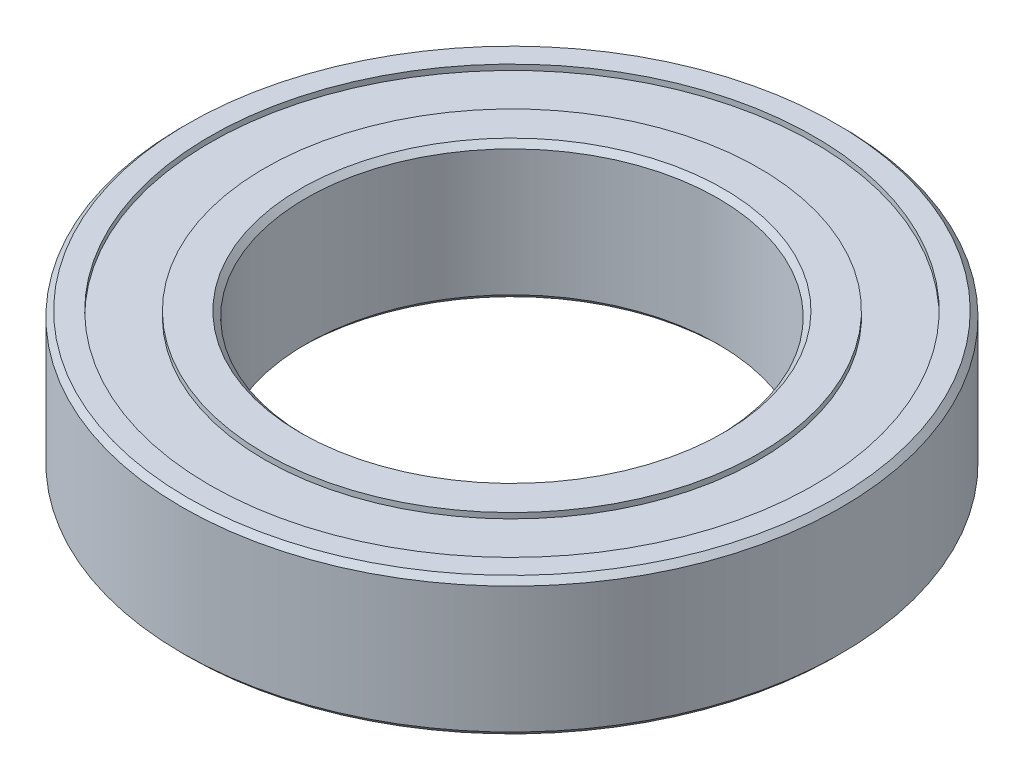
ISO-10303-21;
HEADER;
FILE_DESCRIPTION(('STEP AP214'),'2;1');
FILE_NAME('part.step','',(''),(''),'','','');
FILE_SCHEMA(('AUTOMOTIVE_DESIGN { 1 0 10303 214 1 1 1 1 }'));
ENDSEC;
DATA;
#1=APPLICATION_CONTEXT('core data for automotive mechanical design processes');
#2=APPLICATION_PROTOCOL_DEFINITION('international standard','automotive_design',2000,#1);
#3=PRODUCT_CONTEXT('',#1,'mechanical');
#4=PRODUCT('Part','Part','',(#3));
#5=PRODUCT_RELATED_PRODUCT_CATEGORY('part','',(#4));
#6=PRODUCT_DEFINITION_FORMATION('','',#4);
#7=PRODUCT_DEFINITION_CONTEXT('part definition',#1,'design');
#8=PRODUCT_DEFINITION('design','',#6,#7);
#9=PRODUCT_DEFINITION_SHAPE('','',#8);
#10=(LENGTH_UNIT() NAMED_UNIT(*) SI_UNIT(.MILLI.,.METRE.));
#11=(NAMED_UNIT(*) PLANE_ANGLE_UNIT() SI_UNIT($,.RADIAN.));
#12=(NAMED_UNIT(*) SI_UNIT($,.STERADIAN.) SOLID_ANGLE_UNIT());
#13=UNCERTAINTY_MEASURE_WITH_UNIT(LENGTH_MEASURE(1.E-05),#10,'distance_accuracy_value','');
#14=(GEOMETRIC_REPRESENTATION_CONTEXT(3) GLOBAL_UNCERTAINTY_ASSIGNED_CONTEXT((#13)) GLOBAL_UNIT_ASSIGNED_CONTEXT((#10,
#11,#12)) REPRESENTATION_CONTEXT('',''));
#15=CARTESIAN_POINT('',(0.,0.,0.));
#16=DIRECTION('',(0.,0.,1.));
#17=DIRECTION('',(1.,0.,0.));
#18=AXIS2_PLACEMENT_3D('',#15,#16,#17);
#19=CARTESIAN_POINT('',(0.,0.,0.));
#20=DIRECTION('',(0.,1.,0.));
#21=DIRECTION('',(0.,0.,1.));
#22=AXIS2_PLACEMENT_3D('',#19,#20,#21);
#23=PLANE('',#22);
#24=CARTESIAN_POINT('',(0.,0.,0.));
#25=DIRECTION('',(0.,1.,0.));
#26=DIRECTION('',(0.,0.,1.));
#27=AXIS2_PLACEMENT_3D('',#24,#25,#26);
#28=CIRCLE('',#27,7.7);
#29=CARTESIAN_POINT('',(0.,0.,7.7));
#30=VERTEX_POINT('',#29);
#31=EDGE_CURVE('E10',#30,#30,#28,.T.);
#32=ORIENTED_EDGE('',*,*,#31,.T.);
#33=EDGE_LOOP('',(#32));
#34=FACE_BOUND('',#33,.T.);
#35=CARTESIAN_POINT('',(0.,0.,0.));
#36=DIRECTION('',(0.,-1.,0.));
#37=DIRECTION('',(0.,0.,-1.));
#38=AXIS2_PLACEMENT_3D('',#35,#36,#37);
#39=CIRCLE('',#38,9.);
#40=CARTESIAN_POINT('',(0.,0.,-9.));
#41=VERTEX_POINT('',#40);
#42=EDGE_CURVE('E86',#41,#41,#39,.T.);
#43=ORIENTED_EDGE('',*,*,#42,.T.);
#44=EDGE_LOOP('',(#43));
#45=FACE_BOUND('',#44,.T.);
#46=ADVANCED_FACE('F34',(#34,#45),#23,.F.);
#47=CARTESIAN_POINT('',(0.,5.,0.));
#48=DIRECTION('',(0.,1.,0.));
#49=DIRECTION('',(0.,0.,1.));
#50=AXIS2_PLACEMENT_3D('',#47,#48,#49);
#51=PLANE('',#50);
#52=CARTESIAN_POINT('',(0.,5.,0.));
#53=DIRECTION('',(0.,1.,0.));
#54=DIRECTION('',(0.,0.,1.));
#55=AXIS2_PLACEMENT_3D('',#52,#53,#54);
#56=CIRCLE('',#55,7.7);
#57=CARTESIAN_POINT('',(0.,5.,7.7));
#58=VERTEX_POINT('',#57);
#59=EDGE_CURVE('E42',#58,#58,#56,.F.);
#60=ORIENTED_EDGE('',*,*,#59,.T.);
#61=EDGE_LOOP('',(#60));
#62=FACE_BOUND('',#61,.T.);
#63=CARTESIAN_POINT('',(0.,5.,0.));
#64=DIRECTION('',(0.,1.,0.));
#65=DIRECTION('',(0.,0.,1.));
#66=AXIS2_PLACEMENT_3D('',#63,#64,#65);
#67=CIRCLE('',#66,9.);
#68=CARTESIAN_POINT('',(0.,5.,9.));
#69=VERTEX_POINT('',#68);
#70=EDGE_CURVE('E74',#69,#69,#67,.T.);
#71=ORIENTED_EDGE('',*,*,#70,.T.);
#72=EDGE_LOOP('',(#71));
#73=FACE_BOUND('',#72,.T.);
#74=ADVANCED_FACE('F121',(#62,#73),#51,.T.);
#75=CARTESIAN_POINT('',(0.,5.,0.));
#76=DIRECTION('',(0.,1.,0.));
#77=DIRECTION('',(0.,0.,1.));
#78=AXIS2_PLACEMENT_3D('',#75,#76,#77);
#79=CIRCLE('',#78,11.8);
#80=CARTESIAN_POINT('',(0.,5.,11.8));
#81=VERTEX_POINT('',#80);
#82=EDGE_CURVE('E64',#81,#81,#79,.T.);
#83=ORIENTED_EDGE('',*,*,#82,.T.);
#84=EDGE_LOOP('',(#83));
#85=FACE_BOUND('',#84,.T.);
#86=CARTESIAN_POINT('',(0.,5.,0.));
#87=DIRECTION('',(0.,1.,0.));
#88=DIRECTION('',(0.,0.,1.));
#89=AXIS2_PLACEMENT_3D('',#86,#87,#88);
#90=CIRCLE('',#89,11.);
#91=CARTESIAN_POINT('',(0.,5.,11.));
#92=VERTEX_POINT('',#91);
#93=EDGE_CURVE('E68',#92,#92,#90,.T.);
#94=ORIENTED_EDGE('',*,*,#93,.F.);
#95=EDGE_LOOP('',(#94));
#96=FACE_BOUND('',#95,.T.);
#97=ADVANCED_FACE('F111',(#85,#96),#51,.T.);
#98=CARTESIAN_POINT('',(0.,0.,0.));
#99=DIRECTION('',(0.,1.,0.));
#100=DIRECTION('',(0.,0.,1.));
#101=AXIS2_PLACEMENT_3D('',#98,#99,#100);
#102=CIRCLE('',#101,11.8);
#103=CARTESIAN_POINT('',(0.,0.,11.8));
#104=VERTEX_POINT('',#103);
#105=EDGE_CURVE('E55',#104,#104,#102,.F.);
#106=ORIENTED_EDGE('',*,*,#105,.T.);
#107=EDGE_LOOP('',(#106));
#108=FACE_BOUND('',#107,.T.);
#109=CARTESIAN_POINT('',(0.,0.,0.));
#110=DIRECTION('',(0.,-1.,0.));
#111=DIRECTION('',(0.,0.,-1.));
#112=AXIS2_PLACEMENT_3D('',#109,#110,#111);
#113=CIRCLE('',#112,11.);
#114=CARTESIAN_POINT('',(0.,0.,-11.));
#115=VERTEX_POINT('',#114);
#116=EDGE_CURVE('E80',#115,#115,#113,.T.);
#117=ORIENTED_EDGE('',*,*,#116,.F.);
#118=EDGE_LOOP('',(#117));
#119=FACE_BOUND('',#118,.T.);
#120=ADVANCED_FACE('F108',(#108,#119),#23,.F.);
#121=CARTESIAN_POINT('',(0.,5.,0.));
#122=DIRECTION('',(0.,-1.,0.));
#123=DIRECTION('',(0.,0.,-1.));
#124=AXIS2_PLACEMENT_3D('',#121,#122,#123);
#125=CYLINDRICAL_SURFACE('',#124,12.);
#126=CARTESIAN_POINT('',(0.,4.8,0.));
#127=DIRECTION('',(0.,1.,0.));
#128=DIRECTION('',(0.,0.,1.));
#129=AXIS2_PLACEMENT_3D('',#126,#127,#128);
#130=CIRCLE('',#129,12.);
#131=CARTESIAN_POINT('',(0.,4.8,12.));
#132=VERTEX_POINT('',#131);
#133=EDGE_CURVE('E58',#132,#132,#130,.F.);
#134=ORIENTED_EDGE('',*,*,#133,.T.);
#135=EDGE_LOOP('',(#134));
#136=FACE_BOUND('',#135,.T.);
#137=CARTESIAN_POINT('',(0.,0.200000000000002,0.));
#138=DIRECTION('',(0.,1.,0.));
#139=DIRECTION('',(0.,0.,1.));
#140=AXIS2_PLACEMENT_3D('',#137,#138,#139);
#141=CIRCLE('',#140,12.);
#142=CARTESIAN_POINT('',(0.,0.200000000000002,12.));
#143=VERTEX_POINT('',#142);
#144=EDGE_CURVE('E61',#143,#143,#141,.T.);
#145=ORIENTED_EDGE('',*,*,#144,.T.);
#146=EDGE_LOOP('',(#145));
#147=FACE_BOUND('',#146,.T.);
#148=ADVANCED_FACE('F110',(#136,#147),#125,.T.);
#149=CARTESIAN_POINT('',(0.,5.,0.));
#150=DIRECTION('',(0.,-1.,0.));
#151=DIRECTION('',(0.,0.,-1.));
#152=AXIS2_PLACEMENT_3D('',#149,#150,#151);
#153=CYLINDRICAL_SURFACE('',#152,7.5);
#154=CARTESIAN_POINT('',(0.,4.8,0.));
#155=DIRECTION('',(0.,1.,0.));
#156=DIRECTION('',(0.,0.,1.));
#157=AXIS2_PLACEMENT_3D('',#154,#155,#156);
#158=CIRCLE('',#157,7.5);
#159=CARTESIAN_POINT('',(0.,4.8,7.5));
#160=VERTEX_POINT('',#159);
#161=EDGE_CURVE('E46',#160,#160,#158,.T.);
#162=ORIENTED_EDGE('',*,*,#161,.T.);
#163=EDGE_LOOP('',(#162));
#164=FACE_BOUND('',#163,.T.);
#165=CARTESIAN_POINT('',(0.,0.200000000000001,0.));
#166=DIRECTION('',(0.,1.,0.));
#167=DIRECTION('',(0.,0.,1.));
#168=AXIS2_PLACEMENT_3D('',#165,#166,#167);
#169=CIRCLE('',#168,7.5);
#170=CARTESIAN_POINT('',(0.,0.200000000000001,7.5));
#171=VERTEX_POINT('',#170);
#172=EDGE_CURVE('E50',#171,#171,#169,.F.);
#173=ORIENTED_EDGE('',*,*,#172,.T.);
#174=EDGE_LOOP('',(#173));
#175=FACE_BOUND('',#174,.T.);
#176=ADVANCED_FACE('F118',(#164,#175),#153,.F.);
#177=CARTESIAN_POINT('',(0.,4.8,0.));
#178=DIRECTION('',(0.,1.,0.));
#179=DIRECTION('',(0.,0.,1.));
#180=AXIS2_PLACEMENT_3D('',#177,#178,#179);
#181=CYLINDRICAL_SURFACE('',#180,11.);
#182=CARTESIAN_POINT('',(0.,4.8,0.));
#183=DIRECTION('',(0.,1.,0.));
#184=DIRECTION('',(0.,0.,1.));
#185=AXIS2_PLACEMENT_3D('',#182,#183,#184);
#186=CIRCLE('',#185,11.);
#187=CARTESIAN_POINT('',(0.,4.8,11.));
#188=VERTEX_POINT('',#187);
#189=EDGE_CURVE('E67',#188,#188,#186,.T.);
#190=ORIENTED_EDGE('',*,*,#189,.F.);
#191=EDGE_LOOP('',(#190));
#192=FACE_BOUND('',#191,.T.);
#193=ORIENTED_EDGE('',*,*,#93,.T.);
#194=EDGE_LOOP('',(#193));
#195=FACE_BOUND('',#194,.T.);
#196=ADVANCED_FACE('F146',(#192,#195),#181,.F.);
#197=CARTESIAN_POINT('',(0.,4.8,0.));
#198=DIRECTION('',(0.,1.,0.));
#199=DIRECTION('',(0.,0.,1.));
#200=AXIS2_PLACEMENT_3D('',#197,#198,#199);
#201=PLANE('',#200);
#202=CARTESIAN_POINT('',(0.,4.8,0.));
#203=DIRECTION('',(0.,1.,0.));
#204=DIRECTION('',(0.,0.,1.));
#205=AXIS2_PLACEMENT_3D('',#202,#203,#204);
#206=CIRCLE('',#205,9.);
#207=CARTESIAN_POINT('',(0.,4.8,9.));
#208=VERTEX_POINT('',#207);
#209=EDGE_CURVE('E71',#208,#208,#206,.T.);
#210=ORIENTED_EDGE('',*,*,#209,.F.);
#211=EDGE_LOOP('',(#210));
#212=FACE_BOUND('',#211,.T.);
#213=ORIENTED_EDGE('',*,*,#189,.T.);
#214=EDGE_LOOP('',(#213));
#215=FACE_BOUND('',#214,.T.);
#216=ADVANCED_FACE('F142',(#212,#215),#201,.T.);
#217=CARTESIAN_POINT('',(0.,4.8,0.));
#218=DIRECTION('',(0.,1.,0.));
#219=DIRECTION('',(0.,0.,1.));
#220=AXIS2_PLACEMENT_3D('',#217,#218,#219);
#221=CYLINDRICAL_SURFACE('',#220,9.);
#222=ORIENTED_EDGE('',*,*,#209,.T.);
#223=EDGE_LOOP('',(#222));
#224=FACE_BOUND('',#223,.T.);
#225=ORIENTED_EDGE('',*,*,#70,.F.);
#226=EDGE_LOOP('',(#225));
#227=FACE_BOUND('',#226,.T.);
#228=ADVANCED_FACE('F104',(#224,#227),#221,.T.);
#229=CARTESIAN_POINT('',(0.,0.2,0.));
#230=DIRECTION('',(0.,-1.,0.));
#231=DIRECTION('',(0.,0.,-1.));
#232=AXIS2_PLACEMENT_3D('',#229,#230,#231);
#233=CYLINDRICAL_SURFACE('',#232,11.);
#234=CARTESIAN_POINT('',(0.,0.2,0.));
#235=DIRECTION('',(0.,-1.,0.));
#236=DIRECTION('',(0.,0.,-1.));
#237=AXIS2_PLACEMENT_3D('',#234,#235,#236);
#238=CIRCLE('',#237,11.);
#239=CARTESIAN_POINT('',(0.,0.2,-11.));
#240=VERTEX_POINT('',#239);
#241=EDGE_CURVE('E77',#240,#240,#238,.T.);
#242=ORIENTED_EDGE('',*,*,#241,.F.);
#243=EDGE_LOOP('',(#242));
#244=FACE_BOUND('',#243,.T.);
#245=ORIENTED_EDGE('',*,*,#116,.T.);
#246=EDGE_LOOP('',(#245));
#247=FACE_BOUND('',#246,.T.);
#248=ADVANCED_FACE('F98',(#244,#247),#233,.F.);
#249=CARTESIAN_POINT('',(0.,0.2,0.));
#250=DIRECTION('',(0.,-1.,0.));
#251=DIRECTION('',(0.,0.,-1.));
#252=AXIS2_PLACEMENT_3D('',#249,#250,#251);
#253=PLANE('',#252);
#254=CARTESIAN_POINT('',(0.,0.2,0.));
#255=DIRECTION('',(0.,-1.,0.));
#256=DIRECTION('',(0.,0.,-1.));
#257=AXIS2_PLACEMENT_3D('',#254,#255,#256);
#258=CIRCLE('',#257,9.);
#259=CARTESIAN_POINT('',(0.,0.2,-9.));
#260=VERTEX_POINT('',#259);
#261=EDGE_CURVE('E83',#260,#260,#258,.T.);
#262=ORIENTED_EDGE('',*,*,#261,.F.);
#263=EDGE_LOOP('',(#262));
#264=FACE_BOUND('',#263,.T.);
#265=ORIENTED_EDGE('',*,*,#241,.T.);
#266=EDGE_LOOP('',(#265));
#267=FACE_BOUND('',#266,.T.);
#268=ADVANCED_FACE('F95',(#264,#267),#253,.T.);
#269=CARTESIAN_POINT('',(0.,0.2,0.));
#270=DIRECTION('',(0.,-1.,0.));
#271=DIRECTION('',(0.,0.,-1.));
#272=AXIS2_PLACEMENT_3D('',#269,#270,#271);
#273=CYLINDRICAL_SURFACE('',#272,9.);
#274=ORIENTED_EDGE('',*,*,#261,.T.);
#275=EDGE_LOOP('',(#274));
#276=FACE_BOUND('',#275,.T.);
#277=ORIENTED_EDGE('',*,*,#42,.F.);
#278=EDGE_LOOP('',(#277));
#279=FACE_BOUND('',#278,.T.);
#280=ADVANCED_FACE('F92',(#276,#279),#273,.T.);
#281=CARTESIAN_POINT('',(0.,5.,0.));
#282=DIRECTION('',(0.,-1.,0.));
#283=DIRECTION('',(0.,0.,-1.));
#284=AXIS2_PLACEMENT_3D('',#281,#282,#283);
#285=CONICAL_SURFACE('',#284,11.8,0.785398163397435);
#286=ORIENTED_EDGE('',*,*,#133,.F.);
#287=EDGE_LOOP('',(#286));
#288=FACE_BOUND('',#287,.T.);
#289=ORIENTED_EDGE('',*,*,#82,.F.);
#290=EDGE_LOOP('',(#289));
#291=FACE_BOUND('',#290,.T.);
#292=ADVANCED_FACE('F131',(#288,#291),#285,.T.);
#293=CARTESIAN_POINT('',(0.,0.200000000000002,0.));
#294=DIRECTION('',(0.,1.,0.));
#295=DIRECTION('',(0.,0.,1.));
#296=AXIS2_PLACEMENT_3D('',#293,#294,#295);
#297=CONICAL_SURFACE('',#296,12.,0.785398163397448);
#298=ORIENTED_EDGE('',*,*,#105,.F.);
#299=EDGE_LOOP('',(#298));
#300=FACE_BOUND('',#299,.T.);
#301=ORIENTED_EDGE('',*,*,#144,.F.);
#302=EDGE_LOOP('',(#301));
#303=FACE_BOUND('',#302,.T.);
#304=ADVANCED_FACE('F136',(#300,#303),#297,.T.);
#305=CARTESIAN_POINT('',(0.,4.8,0.));
#306=DIRECTION('',(0.,1.,0.));
#307=DIRECTION('',(0.,0.,1.));
#308=AXIS2_PLACEMENT_3D('',#305,#306,#307);
#309=CONICAL_SURFACE('',#308,7.5,0.785398163397444);
#310=ORIENTED_EDGE('',*,*,#59,.F.);
#311=EDGE_LOOP('',(#310));
#312=FACE_BOUND('',#311,.T.);
#313=ORIENTED_EDGE('',*,*,#161,.F.);
#314=EDGE_LOOP('',(#313));
#315=FACE_BOUND('',#314,.T.);
#316=ADVANCED_FACE('F161',(#312,#315),#309,.F.);
#317=CARTESIAN_POINT('',(0.,0.,0.));
#318=DIRECTION('',(0.,-1.,0.));
#319=DIRECTION('',(0.,0.,-1.));
#320=AXIS2_PLACEMENT_3D('',#317,#318,#319);
#321=CONICAL_SURFACE('',#320,7.7,0.785398163397444);
#322=ORIENTED_EDGE('',*,*,#172,.F.);
#323=EDGE_LOOP('',(#322));
#324=FACE_BOUND('',#323,.T.);
#325=ORIENTED_EDGE('',*,*,#31,.F.);
#326=EDGE_LOOP('',(#325));
#327=FACE_BOUND('',#326,.T.);
#328=ADVANCED_FACE('F37',(#324,#327),#321,.F.);
#329=CLOSED_SHELL('',(#46,#74,#97,#120,#148,#176,#196,#216,#228,#248,#268,#280,#292,#304,#316,#328));
#330=MANIFOLD_SOLID_BREP('B2',#329);
#331=ADVANCED_BREP_SHAPE_REPRESENTATION('',(#18,#330),#14);
#332=SHAPE_DEFINITION_REPRESENTATION(#9,#331);
ENDSEC;
END-ISO-10303-21;
